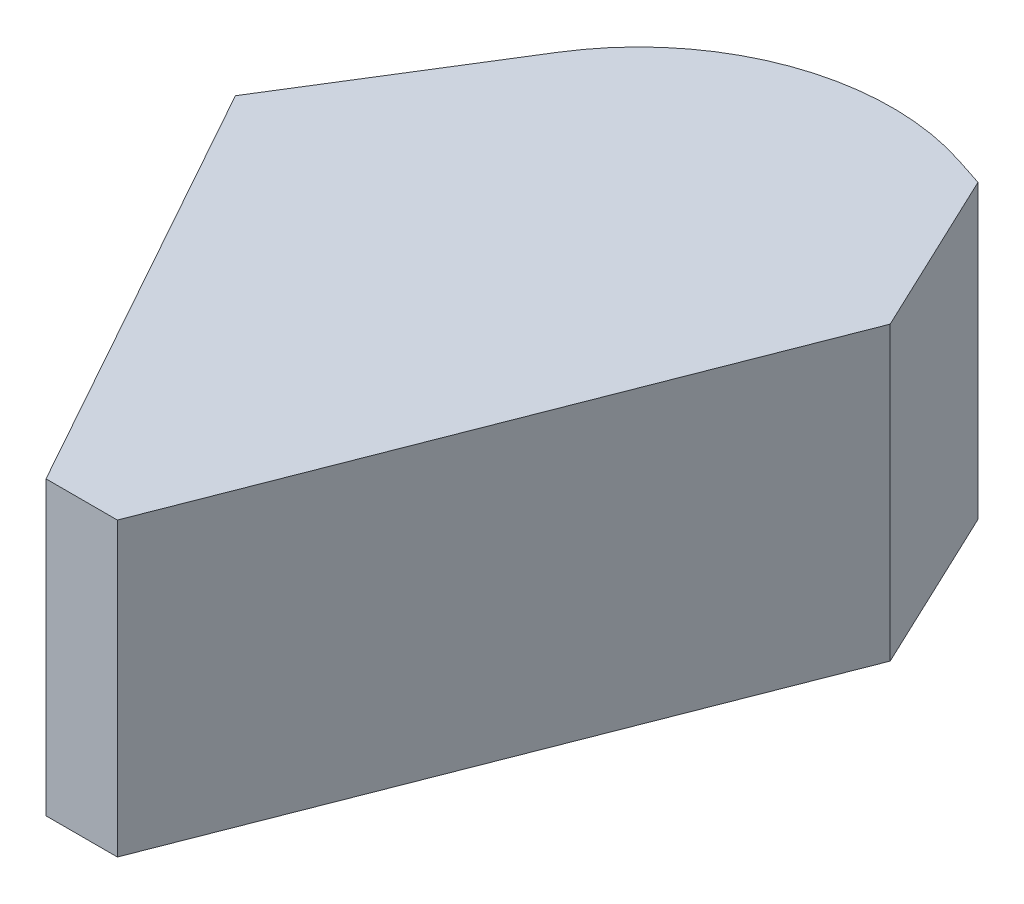
ISO-10303-21;
HEADER;
FILE_DESCRIPTION(('STEP AP214'),'2;1');
FILE_NAME('part.step','',(''),(''),'','','');
FILE_SCHEMA(('AUTOMOTIVE_DESIGN { 1 0 10303 214 1 1 1 1 }'));
ENDSEC;
DATA;
#1=APPLICATION_CONTEXT('core data for automotive mechanical design processes');
#2=APPLICATION_PROTOCOL_DEFINITION('international standard','automotive_design',2000,#1);
#3=PRODUCT_CONTEXT('',#1,'mechanical');
#4=PRODUCT('Part','Part','',(#3));
#5=PRODUCT_RELATED_PRODUCT_CATEGORY('part','',(#4));
#6=PRODUCT_DEFINITION_FORMATION('','',#4);
#7=PRODUCT_DEFINITION_CONTEXT('part definition',#1,'design');
#8=PRODUCT_DEFINITION('design','',#6,#7);
#9=PRODUCT_DEFINITION_SHAPE('','',#8);
#10=(LENGTH_UNIT() NAMED_UNIT(*) SI_UNIT(.MILLI.,.METRE.));
#11=(NAMED_UNIT(*) PLANE_ANGLE_UNIT() SI_UNIT($,.RADIAN.));
#12=(NAMED_UNIT(*) SI_UNIT($,.STERADIAN.) SOLID_ANGLE_UNIT());
#13=UNCERTAINTY_MEASURE_WITH_UNIT(LENGTH_MEASURE(1.E-05),#10,'distance_accuracy_value','');
#14=(GEOMETRIC_REPRESENTATION_CONTEXT(3) GLOBAL_UNCERTAINTY_ASSIGNED_CONTEXT((#13)) GLOBAL_UNIT_ASSIGNED_CONTEXT((#10,
#11,#12)) REPRESENTATION_CONTEXT('',''));
#15=CARTESIAN_POINT('',(0.,0.,0.));
#16=DIRECTION('',(0.,0.,1.));
#17=DIRECTION('',(1.,0.,0.));
#18=AXIS2_PLACEMENT_3D('',#15,#16,#17);
#19=CARTESIAN_POINT('',(-14.2874639386893,58.42,77.4518589102709));
#20=DIRECTION('',(0.874037521020069,0.,-0.485858427784362));
#21=DIRECTION('',(0.,-1.,0.));
#22=AXIS2_PLACEMENT_3D('',#19,#20,#21);
#23=PLANE('',#22);
#24=DIRECTION('',(0.,-1.,0.));
#25=VECTOR('',#24,1.);
#26=CARTESIAN_POINT('',(-14.2874639386893,58.42,77.4518589102709));
#27=LINE('',#26,#25);
#28=CARTESIAN_POINT('',(-14.2874639386893,58.42,77.4518589102709));
#29=VERTEX_POINT('',#28);
#30=CARTESIAN_POINT('',(-14.2874639386893,0.,77.4518589102709));
#31=VERTEX_POINT('',#30);
#32=EDGE_CURVE('E155',#29,#31,#27,.T.);
#33=ORIENTED_EDGE('',*,*,#32,.F.);
#34=DIRECTION('',(-0.485858427784362,0.,-0.874037521020069));
#35=VECTOR('',#34,1.);
#36=CARTESIAN_POINT('',(-14.2874639386893,58.42,77.4518589102709));
#37=LINE('',#36,#35);
#38=CARTESIAN_POINT('',(-61.7472974278838,58.42,-7.92625298147463));
#39=VERTEX_POINT('',#38);
#40=EDGE_CURVE('E53',#39,#29,#37,.F.);
#41=ORIENTED_EDGE('',*,*,#40,.F.);
#42=DIRECTION('',(0.,1.,0.));
#43=VECTOR('',#42,1.);
#44=CARTESIAN_POINT('',(-61.7472974278838,58.42,-7.92625298147463));
#45=LINE('',#44,#43);
#46=CARTESIAN_POINT('',(-61.7472974278838,0.,-7.92625298147463));
#47=VERTEX_POINT('',#46);
#48=EDGE_CURVE('E157',#47,#39,#45,.T.);
#49=ORIENTED_EDGE('',*,*,#48,.F.);
#50=DIRECTION('',(0.485858427784362,0.,0.874037521020069));
#51=VECTOR('',#50,1.);
#52=CARTESIAN_POINT('',(-51.2107956307123,0.,11.0284411935755));
#53=LINE('',#52,#51);
#54=EDGE_CURVE('E13',#31,#47,#53,.F.);
#55=ORIENTED_EDGE('',*,*,#54,.F.);
#56=EDGE_LOOP('',(#33,#41,#49,#55));
#57=FACE_BOUND('',#56,.T.);
#58=ADVANCED_FACE('F45',(#57),#23,.F.);
#59=CARTESIAN_POINT('',(0.,58.42,77.4518589102709));
#60=DIRECTION('',(0.,0.,-1.));
#61=DIRECTION('',(-1.,0.,0.));
#62=AXIS2_PLACEMENT_3D('',#59,#60,#61);
#63=PLANE('',#62);
#64=DIRECTION('',(1.,0.,0.));
#65=VECTOR('',#64,1.);
#66=CARTESIAN_POINT('',(0.,58.42,77.4518589102709));
#67=LINE('',#66,#65);
#68=CARTESIAN_POINT('',(0.,58.42,77.4518589102709));
#69=VERTEX_POINT('',#68);
#70=EDGE_CURVE('E102',#29,#69,#67,.T.);
#71=ORIENTED_EDGE('',*,*,#70,.F.);
#72=ORIENTED_EDGE('',*,*,#32,.T.);
#73=DIRECTION('',(1.,0.,0.));
#74=VECTOR('',#73,1.);
#75=CARTESIAN_POINT('',(0.,0.,77.4518589102709));
#76=LINE('',#75,#74);
#77=CARTESIAN_POINT('',(0.,0.,77.4518589102709));
#78=VERTEX_POINT('',#77);
#79=EDGE_CURVE('E116',#31,#78,#76,.T.);
#80=ORIENTED_EDGE('',*,*,#79,.T.);
#81=DIRECTION('',(0.,-1.,0.));
#82=VECTOR('',#81,1.);
#83=CARTESIAN_POINT('',(0.,58.42,77.4518589102709));
#84=LINE('',#83,#82);
#85=EDGE_CURVE('E114',#69,#78,#84,.T.);
#86=ORIENTED_EDGE('',*,*,#85,.F.);
#87=EDGE_LOOP('',(#71,#72,#80,#86));
#88=FACE_BOUND('',#87,.T.);
#89=ADVANCED_FACE('F115',(#88),#63,.F.);
#90=CARTESIAN_POINT('',(53.1384921973379,58.42,-58.9035172942189));
#91=DIRECTION('',(-0.93174729177176,0.,-0.363107400469877));
#92=DIRECTION('',(-0.363107400469877,0.,0.93174729177176));
#93=AXIS2_PLACEMENT_3D('',#90,#91,#92);
#94=PLANE('',#93);
#95=DIRECTION('',(0.363107400469877,0.,-0.93174729177176));
#96=VECTOR('',#95,1.);
#97=CARTESIAN_POINT('',(53.1384921973379,0.,-58.9035172942189));
#98=LINE('',#97,#96);
#99=CARTESIAN_POINT('',(43.3802867284577,0.,-33.8635938269037));
#100=VERTEX_POINT('',#99);
#101=EDGE_CURVE('E136',#78,#100,#98,.T.);
#102=ORIENTED_EDGE('',*,*,#101,.T.);
#103=DIRECTION('',(0.,1.,0.));
#104=VECTOR('',#103,1.);
#105=CARTESIAN_POINT('',(43.3802867284577,58.42,-33.8635938269037));
#106=LINE('',#105,#104);
#107=CARTESIAN_POINT('',(43.3802867284577,58.42,-33.8635938269037));
#108=VERTEX_POINT('',#107);
#109=EDGE_CURVE('E125',#100,#108,#106,.T.);
#110=ORIENTED_EDGE('',*,*,#109,.T.);
#111=DIRECTION('',(0.363107400469877,0.,-0.93174729177176));
#112=VECTOR('',#111,1.);
#113=CARTESIAN_POINT('',(53.1384921973379,58.42,-58.9035172942189));
#114=LINE('',#113,#112);
#115=EDGE_CURVE('E107',#69,#108,#114,.T.);
#116=ORIENTED_EDGE('',*,*,#115,.F.);
#117=ORIENTED_EDGE('',*,*,#85,.T.);
#118=EDGE_LOOP('',(#102,#110,#116,#117));
#119=FACE_BOUND('',#118,.T.);
#120=ADVANCED_FACE('F123',(#119),#94,.F.);
#121=CARTESIAN_POINT('',(21.8265277700403,58.42,-69.1139404770334));
#122=DIRECTION('',(-0.310020599830917,0.,0.950729839481479));
#123=DIRECTION('',(0.950729839481479,0.,0.310020599830917));
#124=AXIS2_PLACEMENT_3D('',#121,#122,#123);
#125=PLANE('',#124);
#126=DIRECTION('',(-0.950729839481479,0.,-0.310020599830917));
#127=VECTOR('',#126,1.);
#128=CARTESIAN_POINT('',(21.8265277700403,58.42,-69.1139404770334));
#129=LINE('',#128,#127);
#130=CARTESIAN_POINT('',(27.5884287531603,58.42,-67.2350597216681));
#131=VERTEX_POINT('',#130);
#132=CARTESIAN_POINT('',(21.8265277700403,58.42,-69.1139404770334));
#133=VERTEX_POINT('',#132);
#134=EDGE_CURVE('E126',#131,#133,#129,.T.);
#135=ORIENTED_EDGE('',*,*,#134,.F.);
#136=DIRECTION('',(0.,-1.,0.));
#137=VECTOR('',#136,1.);
#138=CARTESIAN_POINT('',(27.5884287531603,58.42,-67.2350597216681));
#139=LINE('',#138,#137);
#140=CARTESIAN_POINT('',(27.5884287531603,0.,-67.2350597216681));
#141=VERTEX_POINT('',#140);
#142=EDGE_CURVE('E120',#131,#141,#139,.T.);
#143=ORIENTED_EDGE('',*,*,#142,.T.);
#144=DIRECTION('',(-0.950729839481479,0.,-0.310020599830917));
#145=VECTOR('',#144,1.);
#146=CARTESIAN_POINT('',(21.8265277700403,0.,-69.1139404770334));
#147=LINE('',#146,#145);
#148=CARTESIAN_POINT('',(21.8265277700403,0.,-69.1139404770334));
#149=VERTEX_POINT('',#148);
#150=EDGE_CURVE('E138',#141,#149,#147,.T.);
#151=ORIENTED_EDGE('',*,*,#150,.T.);
#152=DIRECTION('',(0.,-1.,0.));
#153=VECTOR('',#152,1.);
#154=CARTESIAN_POINT('',(21.8265277700403,58.42,-69.1139404770334));
#155=LINE('',#154,#153);
#156=EDGE_CURVE('E121',#133,#149,#155,.T.);
#157=ORIENTED_EDGE('',*,*,#156,.F.);
#158=EDGE_LOOP('',(#135,#143,#151,#157));
#159=FACE_BOUND('',#158,.T.);
#160=ADVANCED_FACE('F171',(#159),#125,.F.);
#161=CARTESIAN_POINT('',(6.07748129862949,58.42,-20.8168646313743));
#162=DIRECTION('',(0.,-1.,0.));
#163=DIRECTION('',(0.,0.,-1.));
#164=AXIS2_PLACEMENT_3D('',#161,#162,#163);
#165=CYLINDRICAL_SURFACE('',#164,50.8);
#166=CARTESIAN_POINT('',(6.07748129862949,0.,-20.8168646313743));
#167=DIRECTION('',(0.,1.,0.));
#168=DIRECTION('',(0.,0.,-1.));
#169=AXIS2_PLACEMENT_3D('',#166,#167,#168);
#170=CIRCLE('',#169,50.8);
#171=CARTESIAN_POINT('',(-37.0678218733656,0.,-47.6333299875063));
#172=VERTEX_POINT('',#171);
#173=EDGE_CURVE('E140',#149,#172,#170,.T.);
#174=ORIENTED_EDGE('',*,*,#173,.T.);
#175=DIRECTION('',(0.,-1.,0.));
#176=VECTOR('',#175,1.);
#177=CARTESIAN_POINT('',(-37.0678218733656,58.42,-47.6333299875063));
#178=LINE('',#177,#176);
#179=CARTESIAN_POINT('',(-37.0678218733656,58.42,-47.6333299875063));
#180=VERTEX_POINT('',#179);
#181=EDGE_CURVE('E134',#180,#172,#178,.T.);
#182=ORIENTED_EDGE('',*,*,#181,.F.);
#183=CARTESIAN_POINT('',(6.07748129862949,58.42,-20.8168646313743));
#184=DIRECTION('',(0.,1.,0.));
#185=DIRECTION('',(0.,0.,-1.));
#186=AXIS2_PLACEMENT_3D('',#183,#184,#185);
#187=CIRCLE('',#186,50.8);
#188=EDGE_CURVE('E128',#133,#180,#187,.T.);
#189=ORIENTED_EDGE('',*,*,#188,.F.);
#190=ORIENTED_EDGE('',*,*,#156,.T.);
#191=EDGE_LOOP('',(#174,#182,#189,#190));
#192=FACE_BOUND('',#191,.T.);
#193=ADVANCED_FACE('F166',(#192),#165,.T.);
#194=CARTESIAN_POINT('',(-66.6737685117542,58.42,0.));
#195=DIRECTION('',(0.849316991574704,0.,0.527883176301816));
#196=DIRECTION('',(0.527883176301816,0.,-0.849316991574704));
#197=AXIS2_PLACEMENT_3D('',#194,#195,#196);
#198=PLANE('',#197);
#199=DIRECTION('',(-0.527883176301816,0.,0.849316991574704));
#200=VECTOR('',#199,1.);
#201=CARTESIAN_POINT('',(-66.6737685117542,0.,0.));
#202=LINE('',#201,#200);
#203=EDGE_CURVE('E111',#172,#47,#202,.T.);
#204=ORIENTED_EDGE('',*,*,#203,.T.);
#205=ORIENTED_EDGE('',*,*,#48,.T.);
#206=DIRECTION('',(-0.527883176301816,0.,0.849316991574704));
#207=VECTOR('',#206,1.);
#208=CARTESIAN_POINT('',(-66.6737685117542,58.42,0.));
#209=LINE('',#208,#207);
#210=EDGE_CURVE('E132',#180,#39,#209,.T.);
#211=ORIENTED_EDGE('',*,*,#210,.F.);
#212=ORIENTED_EDGE('',*,*,#181,.T.);
#213=EDGE_LOOP('',(#204,#205,#211,#212));
#214=FACE_BOUND('',#213,.T.);
#215=ADVANCED_FACE('F160',(#214),#198,.F.);
#216=CARTESIAN_POINT('',(6.07748129862949,58.42,-20.8168646313743));
#217=DIRECTION('',(0.,-1.,0.));
#218=DIRECTION('',(0.,0.,-1.));
#219=AXIS2_PLACEMENT_3D('',#216,#217,#218);
#220=PLANE('',#219);
#221=ORIENTED_EDGE('',*,*,#210,.T.);
#222=ORIENTED_EDGE('',*,*,#40,.T.);
#223=ORIENTED_EDGE('',*,*,#70,.T.);
#224=ORIENTED_EDGE('',*,*,#115,.T.);
#225=DIRECTION('',(0.427739468105776,0.,0.903902067385946));
#226=VECTOR('',#225,1.);
#227=CARTESIAN_POINT('',(27.5884287531603,58.42,-67.2350597216681));
#228=LINE('',#227,#226);
#229=EDGE_CURVE('E153',#108,#131,#228,.F.);
#230=ORIENTED_EDGE('',*,*,#229,.T.);
#231=ORIENTED_EDGE('',*,*,#134,.T.);
#232=ORIENTED_EDGE('',*,*,#188,.T.);
#233=EDGE_LOOP('',(#221,#222,#223,#224,#230,#231,#232));
#234=FACE_BOUND('',#233,.T.);
#235=ADVANCED_FACE('F105',(#234),#220,.F.);
#236=CARTESIAN_POINT('',(6.07748129862949,0.,-20.8168646313743));
#237=DIRECTION('',(0.,-1.,0.));
#238=DIRECTION('',(0.,0.,-1.));
#239=AXIS2_PLACEMENT_3D('',#236,#237,#238);
#240=PLANE('',#239);
#241=ORIENTED_EDGE('',*,*,#79,.F.);
#242=ORIENTED_EDGE('',*,*,#54,.T.);
#243=ORIENTED_EDGE('',*,*,#203,.F.);
#244=ORIENTED_EDGE('',*,*,#173,.F.);
#245=ORIENTED_EDGE('',*,*,#150,.F.);
#246=DIRECTION('',(-0.427739468105776,0.,-0.903902067385946));
#247=VECTOR('',#246,1.);
#248=CARTESIAN_POINT('',(41.5996429701367,0.,-37.6264628030868));
#249=LINE('',#248,#247);
#250=EDGE_CURVE('E150',#141,#100,#249,.F.);
#251=ORIENTED_EDGE('',*,*,#250,.T.);
#252=ORIENTED_EDGE('',*,*,#101,.F.);
#253=EDGE_LOOP('',(#241,#242,#243,#244,#245,#251,#252));
#254=FACE_BOUND('',#253,.T.);
#255=ADVANCED_FACE('F168',(#254),#240,.T.);
#256=CARTESIAN_POINT('',(27.5884287531603,58.42,-67.2350597216681));
#257=DIRECTION('',(-0.903902067385946,0.,0.427739468105776));
#258=DIRECTION('',(0.,-1.,0.));
#259=AXIS2_PLACEMENT_3D('',#256,#257,#258);
#260=PLANE('',#259);
#261=ORIENTED_EDGE('',*,*,#229,.F.);
#262=ORIENTED_EDGE('',*,*,#109,.F.);
#263=ORIENTED_EDGE('',*,*,#250,.F.);
#264=ORIENTED_EDGE('',*,*,#142,.F.);
#265=EDGE_LOOP('',(#261,#262,#263,#264));
#266=FACE_BOUND('',#265,.T.);
#267=ADVANCED_FACE('F174',(#266),#260,.F.);
#268=CLOSED_SHELL('',(#58,#89,#120,#160,#193,#215,#235,#255,#267));
#269=MANIFOLD_SOLID_BREP('B2',#268);
#270=ADVANCED_BREP_SHAPE_REPRESENTATION('',(#18,#269),#14);
#271=SHAPE_DEFINITION_REPRESENTATION(#9,#270);
ENDSEC;
END-ISO-10303-21;
